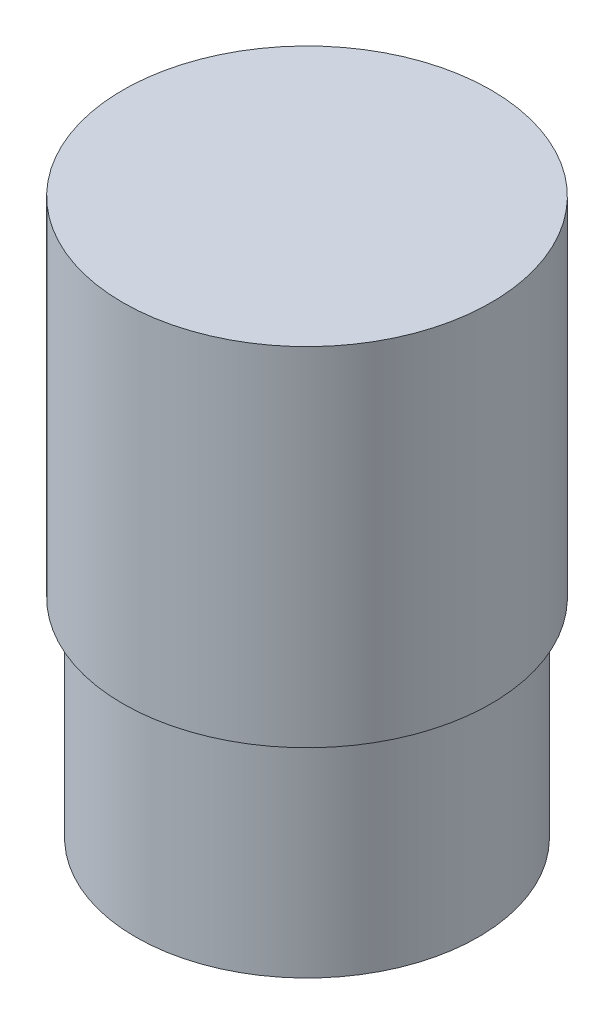
ISO-10303-21;
HEADER;
FILE_DESCRIPTION(('STEP AP214'),'2;1');
FILE_NAME('part.step','',(''),(''),'','','');
FILE_SCHEMA(('AUTOMOTIVE_DESIGN { 1 0 10303 214 1 1 1 1 }'));
ENDSEC;
DATA;
#1=APPLICATION_CONTEXT('core data for automotive mechanical design processes');
#2=APPLICATION_PROTOCOL_DEFINITION('international standard','automotive_design',2000,#1);
#3=PRODUCT_CONTEXT('',#1,'mechanical');
#4=PRODUCT('Part','Part','',(#3));
#5=PRODUCT_RELATED_PRODUCT_CATEGORY('part','',(#4));
#6=PRODUCT_DEFINITION_FORMATION('','',#4);
#7=PRODUCT_DEFINITION_CONTEXT('part definition',#1,'design');
#8=PRODUCT_DEFINITION('design','',#6,#7);
#9=PRODUCT_DEFINITION_SHAPE('','',#8);
#10=(LENGTH_UNIT() NAMED_UNIT(*) SI_UNIT(.MILLI.,.METRE.));
#11=(NAMED_UNIT(*) PLANE_ANGLE_UNIT() SI_UNIT($,.RADIAN.));
#12=(NAMED_UNIT(*) SI_UNIT($,.STERADIAN.) SOLID_ANGLE_UNIT());
#13=UNCERTAINTY_MEASURE_WITH_UNIT(LENGTH_MEASURE(1.E-05),#10,'distance_accuracy_value','');
#14=(GEOMETRIC_REPRESENTATION_CONTEXT(3) GLOBAL_UNCERTAINTY_ASSIGNED_CONTEXT((#13)) GLOBAL_UNIT_ASSIGNED_CONTEXT((#10,
#11,#12)) REPRESENTATION_CONTEXT('',''));
#15=CARTESIAN_POINT('',(0.,0.,0.));
#16=DIRECTION('',(0.,0.,1.));
#17=DIRECTION('',(1.,0.,0.));
#18=AXIS2_PLACEMENT_3D('',#15,#16,#17);
#19=CARTESIAN_POINT('',(0.,-90.95,0.));
#20=DIRECTION('',(0.,-1.,0.));
#21=DIRECTION('',(0.,0.,-1.));
#22=AXIS2_PLACEMENT_3D('',#19,#20,#21);
#23=PLANE('',#22);
#24=CARTESIAN_POINT('',(0.,-90.95,0.));
#25=DIRECTION('',(0.,1.,0.));
#26=DIRECTION('',(0.,0.,1.));
#27=AXIS2_PLACEMENT_3D('',#24,#25,#26);
#28=CIRCLE('',#27,7.95000000000001);
#29=CARTESIAN_POINT('',(0.,-90.95,7.95000000000001));
#30=VERTEX_POINT('',#29);
#31=EDGE_CURVE('E10',#30,#30,#28,.T.);
#32=ORIENTED_EDGE('',*,*,#31,.T.);
#33=EDGE_LOOP('',(#32));
#34=FACE_BOUND('',#33,.T.);
#35=ADVANCED_FACE('F34',(#34),#23,.F.);
#36=CARTESIAN_POINT('',(0.,-65.3275464649069,0.));
#37=DIRECTION('',(0.,1.,0.));
#38=DIRECTION('',(0.,0.,1.));
#39=AXIS2_PLACEMENT_3D('',#36,#37,#38);
#40=CYLINDRICAL_SURFACE('',#39,7.95000000000001);
#41=ORIENTED_EDGE('',*,*,#31,.F.);
#42=EDGE_LOOP('',(#41));
#43=FACE_BOUND('',#42,.T.);
#44=CARTESIAN_POINT('',(0.,-105.95,0.));
#45=DIRECTION('',(0.,1.,0.));
#46=DIRECTION('',(0.,0.,1.));
#47=AXIS2_PLACEMENT_3D('',#44,#45,#46);
#48=CIRCLE('',#47,7.95000000000001);
#49=CARTESIAN_POINT('',(0.,-105.95,7.95000000000001));
#50=VERTEX_POINT('',#49);
#51=EDGE_CURVE('E40',#50,#50,#48,.T.);
#52=ORIENTED_EDGE('',*,*,#51,.T.);
#53=EDGE_LOOP('',(#52));
#54=FACE_BOUND('',#53,.T.);
#55=ADVANCED_FACE('F66',(#43,#54),#40,.T.);
#56=CARTESIAN_POINT('',(7.95000000000001,-105.95,0.));
#57=DIRECTION('',(0.,1.,0.));
#58=DIRECTION('',(0.,0.,1.));
#59=AXIS2_PLACEMENT_3D('',#56,#57,#58);
#60=PLANE('',#59);
#61=ORIENTED_EDGE('',*,*,#51,.F.);
#62=EDGE_LOOP('',(#61));
#63=FACE_BOUND('',#62,.T.);
#64=CARTESIAN_POINT('',(0.,-105.95,0.));
#65=DIRECTION('',(0.,1.,0.));
#66=DIRECTION('',(0.,0.,1.));
#67=AXIS2_PLACEMENT_3D('',#64,#65,#66);
#68=CIRCLE('',#67,7.40000000000001);
#69=CARTESIAN_POINT('',(0.,-105.95,7.40000000000001));
#70=VERTEX_POINT('',#69);
#71=EDGE_CURVE('E44',#70,#70,#68,.T.);
#72=ORIENTED_EDGE('',*,*,#71,.T.);
#73=EDGE_LOOP('',(#72));
#74=FACE_BOUND('',#73,.T.);
#75=ADVANCED_FACE('F62',(#63,#74),#60,.F.);
#76=CARTESIAN_POINT('',(0.,-65.3275464649069,0.));
#77=DIRECTION('',(0.,1.,0.));
#78=DIRECTION('',(0.,0.,1.));
#79=AXIS2_PLACEMENT_3D('',#76,#77,#78);
#80=CYLINDRICAL_SURFACE('',#79,7.40000000000001);
#81=ORIENTED_EDGE('',*,*,#71,.F.);
#82=EDGE_LOOP('',(#81));
#83=FACE_BOUND('',#82,.T.);
#84=CARTESIAN_POINT('',(0.,-114.95,0.));
#85=DIRECTION('',(0.,1.,0.));
#86=DIRECTION('',(0.,0.,1.));
#87=AXIS2_PLACEMENT_3D('',#84,#85,#86);
#88=CIRCLE('',#87,7.40000000000001);
#89=CARTESIAN_POINT('',(0.,-114.95,7.40000000000001));
#90=VERTEX_POINT('',#89);
#91=EDGE_CURVE('E48',#90,#90,#88,.T.);
#92=ORIENTED_EDGE('',*,*,#91,.T.);
#93=EDGE_LOOP('',(#92));
#94=FACE_BOUND('',#93,.T.);
#95=ADVANCED_FACE('F54',(#83,#94),#80,.T.);
#96=CARTESIAN_POINT('',(7.40000000000001,-114.95,0.));
#97=DIRECTION('',(0.,1.,0.));
#98=DIRECTION('',(0.,0.,1.));
#99=AXIS2_PLACEMENT_3D('',#96,#97,#98);
#100=PLANE('',#99);
#101=ORIENTED_EDGE('',*,*,#91,.F.);
#102=EDGE_LOOP('',(#101));
#103=FACE_BOUND('',#102,.T.);
#104=ADVANCED_FACE('F56',(#103),#100,.F.);
#105=CLOSED_SHELL('',(#35,#55,#75,#95,#104));
#106=MANIFOLD_SOLID_BREP('B2',#105);
#107=ADVANCED_BREP_SHAPE_REPRESENTATION('',(#18,#106),#14);
#108=SHAPE_DEFINITION_REPRESENTATION(#9,#107);
ENDSEC;
END-ISO-10303-21;
